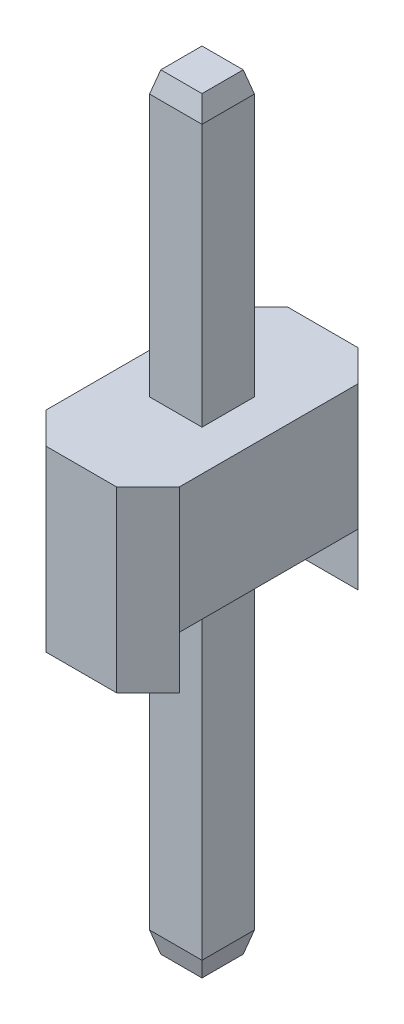
ISO-10303-21;
HEADER;
FILE_DESCRIPTION(('STEP AP214'),'2;1');
FILE_NAME('part.step','',(''),(''),'','','');
FILE_SCHEMA(('AUTOMOTIVE_DESIGN { 1 0 10303 214 1 1 1 1 }'));
ENDSEC;
DATA;
#1=APPLICATION_CONTEXT('core data for automotive mechanical design processes');
#2=APPLICATION_PROTOCOL_DEFINITION('international standard','automotive_design',2000,#1);
#3=PRODUCT_CONTEXT('',#1,'mechanical');
#4=PRODUCT('Part','Part','',(#3));
#5=PRODUCT_RELATED_PRODUCT_CATEGORY('part','',(#4));
#6=PRODUCT_DEFINITION_FORMATION('','',#4);
#7=PRODUCT_DEFINITION_CONTEXT('part definition',#1,'design');
#8=PRODUCT_DEFINITION('design','',#6,#7);
#9=PRODUCT_DEFINITION_SHAPE('','',#8);
#10=(LENGTH_UNIT() NAMED_UNIT(*) SI_UNIT(.MILLI.,.METRE.));
#11=(NAMED_UNIT(*) PLANE_ANGLE_UNIT() SI_UNIT($,.RADIAN.));
#12=(NAMED_UNIT(*) SI_UNIT($,.STERADIAN.) SOLID_ANGLE_UNIT());
#13=UNCERTAINTY_MEASURE_WITH_UNIT(LENGTH_MEASURE(1.E-05),#10,'distance_accuracy_value','');
#14=(GEOMETRIC_REPRESENTATION_CONTEXT(3) GLOBAL_UNCERTAINTY_ASSIGNED_CONTEXT((#13)) GLOBAL_UNIT_ASSIGNED_CONTEXT((#10,
#11,#12)) REPRESENTATION_CONTEXT('',''));
#15=CARTESIAN_POINT('',(0.,0.,0.));
#16=DIRECTION('',(0.,0.,1.));
#17=DIRECTION('',(1.,0.,0.));
#18=AXIS2_PLACEMENT_3D('',#15,#16,#17);
#19=CARTESIAN_POINT('',(0.,0.5,0.));
#20=DIRECTION('',(0.,-1.,0.));
#21=DIRECTION('',(0.,0.,-1.));
#22=AXIS2_PLACEMENT_3D('',#19,#20,#21);
#23=PLANE('',#22);
#24=DIRECTION('',(0.,0.,-1.));
#25=VECTOR('',#24,1.);
#26=CARTESIAN_POINT('',(-0.635,0.5,0.849999999999998));
#27=LINE('',#26,#25);
#28=CARTESIAN_POINT('',(-0.635,0.5,0.849999999999998));
#29=VERTEX_POINT('',#28);
#30=CARTESIAN_POINT('',(-0.635,0.5,-0.849999999999999));
#31=VERTEX_POINT('',#30);
#32=EDGE_CURVE('E241',#29,#31,#27,.T.);
#33=ORIENTED_EDGE('',*,*,#32,.T.);
#34=DIRECTION('',(1.,0.,0.));
#35=VECTOR('',#34,1.);
#36=CARTESIAN_POINT('',(-0.635,0.5,-0.849999999999999));
#37=LINE('',#36,#35);
#38=CARTESIAN_POINT('',(0.635,0.5,-0.849999999999999));
#39=VERTEX_POINT('',#38);
#40=EDGE_CURVE('E244',#31,#39,#37,.T.);
#41=ORIENTED_EDGE('',*,*,#40,.T.);
#42=DIRECTION('',(0.,0.,1.));
#43=VECTOR('',#42,1.);
#44=CARTESIAN_POINT('',(0.635,0.5,0.849999999999998));
#45=LINE('',#44,#43);
#46=CARTESIAN_POINT('',(0.635,0.5,0.849999999999998));
#47=VERTEX_POINT('',#46);
#48=EDGE_CURVE('E248',#39,#47,#45,.T.);
#49=ORIENTED_EDGE('',*,*,#48,.T.);
#50=DIRECTION('',(-1.,0.,0.));
#51=VECTOR('',#50,1.);
#52=CARTESIAN_POINT('',(-0.635,0.5,0.849999999999998));
#53=LINE('',#52,#51);
#54=EDGE_CURVE('E250',#47,#29,#53,.T.);
#55=ORIENTED_EDGE('',*,*,#54,.T.);
#56=EDGE_LOOP('',(#33,#41,#49,#55));
#57=FACE_BOUND('',#56,.T.);
#58=DIRECTION('',(0.,0.,-1.));
#59=VECTOR('',#58,1.);
#60=CARTESIAN_POINT('',(-0.25,0.5,0.25));
#61=LINE('',#60,#59);
#62=CARTESIAN_POINT('',(-0.25,0.5,0.25));
#63=VERTEX_POINT('',#62);
#64=CARTESIAN_POINT('',(-0.25,0.5,-0.25));
#65=VERTEX_POINT('',#64);
#66=EDGE_CURVE('E201',#63,#65,#61,.T.);
#67=ORIENTED_EDGE('',*,*,#66,.F.);
#68=DIRECTION('',(-1.,0.,0.));
#69=VECTOR('',#68,1.);
#70=CARTESIAN_POINT('',(0.25,0.5,0.25));
#71=LINE('',#70,#69);
#72=CARTESIAN_POINT('',(0.25,0.5,0.25));
#73=VERTEX_POINT('',#72);
#74=EDGE_CURVE('E213',#73,#63,#71,.T.);
#75=ORIENTED_EDGE('',*,*,#74,.F.);
#76=DIRECTION('',(0.,0.,1.));
#77=VECTOR('',#76,1.);
#78=CARTESIAN_POINT('',(0.25,0.5,0.25));
#79=LINE('',#78,#77);
#80=CARTESIAN_POINT('',(0.25,0.5,-0.25));
#81=VERTEX_POINT('',#80);
#82=EDGE_CURVE('E211',#81,#73,#79,.T.);
#83=ORIENTED_EDGE('',*,*,#82,.F.);
#84=DIRECTION('',(1.,0.,0.));
#85=VECTOR('',#84,1.);
#86=CARTESIAN_POINT('',(0.25,0.5,-0.25));
#87=LINE('',#86,#85);
#88=EDGE_CURVE('E190',#65,#81,#87,.T.);
#89=ORIENTED_EDGE('',*,*,#88,.F.);
#90=EDGE_LOOP('',(#67,#75,#83,#89));
#91=FACE_BOUND('',#90,.T.);
#92=ADVANCED_FACE('F35',(#57,#91),#23,.T.);
#93=CARTESIAN_POINT('',(0.,1.7,0.));
#94=DIRECTION('',(0.,-1.,0.));
#95=DIRECTION('',(0.,0.,-1.));
#96=AXIS2_PLACEMENT_3D('',#93,#94,#95);
#97=PLANE('',#96);
#98=DIRECTION('',(-1.,0.,0.));
#99=VECTOR('',#98,1.);
#100=CARTESIAN_POINT('',(0.635,1.7,-1.15));
#101=LINE('',#100,#99);
#102=CARTESIAN_POINT('',(0.335,1.7,-1.15));
#103=VERTEX_POINT('',#102);
#104=CARTESIAN_POINT('',(-0.334999999999999,1.7,-1.15));
#105=VERTEX_POINT('',#104);
#106=EDGE_CURVE('E270',#103,#105,#101,.T.);
#107=ORIENTED_EDGE('',*,*,#106,.T.);
#108=DIRECTION('',(0.707106781186548,0.,-0.707106781186547));
#109=VECTOR('',#108,1.);
#110=CARTESIAN_POINT('',(-0.635,1.7,-0.85));
#111=LINE('',#110,#109);
#112=CARTESIAN_POINT('',(-0.635,1.7,-0.85));
#113=VERTEX_POINT('',#112);
#114=EDGE_CURVE('E304',#105,#113,#111,.F.);
#115=ORIENTED_EDGE('',*,*,#114,.T.);
#116=DIRECTION('',(0.,0.,1.));
#117=VECTOR('',#116,1.);
#118=CARTESIAN_POINT('',(-0.635,1.7,-1.15));
#119=LINE('',#118,#117);
#120=CARTESIAN_POINT('',(-0.635,1.7,0.849999999999998));
#121=VERTEX_POINT('',#120);
#122=EDGE_CURVE('E260',#113,#121,#119,.T.);
#123=ORIENTED_EDGE('',*,*,#122,.T.);
#124=DIRECTION('',(-0.707106781186546,0.,-0.707106781186549));
#125=VECTOR('',#124,1.);
#126=CARTESIAN_POINT('',(-0.335,1.7,1.15));
#127=LINE('',#126,#125);
#128=CARTESIAN_POINT('',(-0.335,1.7,1.15));
#129=VERTEX_POINT('',#128);
#130=EDGE_CURVE('E298',#121,#129,#127,.F.);
#131=ORIENTED_EDGE('',*,*,#130,.T.);
#132=DIRECTION('',(1.,0.,0.));
#133=VECTOR('',#132,1.);
#134=CARTESIAN_POINT('',(0.635,1.7,1.15));
#135=LINE('',#134,#133);
#136=CARTESIAN_POINT('',(0.334999999999999,1.7,1.15));
#137=VERTEX_POINT('',#136);
#138=EDGE_CURVE('E263',#129,#137,#135,.T.);
#139=ORIENTED_EDGE('',*,*,#138,.T.);
#140=DIRECTION('',(-0.707106781186548,0.,0.707106781186547));
#141=VECTOR('',#140,1.);
#142=CARTESIAN_POINT('',(0.635,1.7,0.85));
#143=LINE('',#142,#141);
#144=CARTESIAN_POINT('',(0.635,1.7,0.85));
#145=VERTEX_POINT('',#144);
#146=EDGE_CURVE('E300',#137,#145,#143,.F.);
#147=ORIENTED_EDGE('',*,*,#146,.T.);
#148=DIRECTION('',(0.,0.,-1.));
#149=VECTOR('',#148,1.);
#150=CARTESIAN_POINT('',(0.635,1.7,-1.15));
#151=LINE('',#150,#149);
#152=CARTESIAN_POINT('',(0.635,1.7,-0.849999999999999));
#153=VERTEX_POINT('',#152);
#154=EDGE_CURVE('E267',#145,#153,#151,.T.);
#155=ORIENTED_EDGE('',*,*,#154,.T.);
#156=DIRECTION('',(0.707106781186546,0.,0.707106781186549));
#157=VECTOR('',#156,1.);
#158=CARTESIAN_POINT('',(0.335,1.7,-1.15));
#159=LINE('',#158,#157);
#160=EDGE_CURVE('E302',#153,#103,#159,.F.);
#161=ORIENTED_EDGE('',*,*,#160,.T.);
#162=EDGE_LOOP('',(#107,#115,#123,#131,#139,#147,#155,#161));
#163=FACE_BOUND('',#162,.T.);
#164=DIRECTION('',(0.,0.,-1.));
#165=VECTOR('',#164,1.);
#166=CARTESIAN_POINT('',(0.25,1.7,-0.25));
#167=LINE('',#166,#165);
#168=CARTESIAN_POINT('',(0.25,1.7,0.25));
#169=VERTEX_POINT('',#168);
#170=CARTESIAN_POINT('',(0.25,1.7,-0.25));
#171=VERTEX_POINT('',#170);
#172=EDGE_CURVE('E197',#169,#171,#167,.T.);
#173=ORIENTED_EDGE('',*,*,#172,.F.);
#174=DIRECTION('',(1.,0.,0.));
#175=VECTOR('',#174,1.);
#176=CARTESIAN_POINT('',(-0.25,1.7,0.25));
#177=LINE('',#176,#175);
#178=CARTESIAN_POINT('',(-0.25,1.7,0.25));
#179=VERTEX_POINT('',#178);
#180=EDGE_CURVE('E229',#179,#169,#177,.T.);
#181=ORIENTED_EDGE('',*,*,#180,.F.);
#182=DIRECTION('',(0.,0.,1.));
#183=VECTOR('',#182,1.);
#184=CARTESIAN_POINT('',(-0.25,1.7,-0.25));
#185=LINE('',#184,#183);
#186=CARTESIAN_POINT('',(-0.25,1.7,-0.25));
#187=VERTEX_POINT('',#186);
#188=EDGE_CURVE('E226',#187,#179,#185,.T.);
#189=ORIENTED_EDGE('',*,*,#188,.F.);
#190=DIRECTION('',(-1.,0.,0.));
#191=VECTOR('',#190,1.);
#192=CARTESIAN_POINT('',(-0.25,1.7,-0.25));
#193=LINE('',#192,#191);
#194=EDGE_CURVE('E223',#171,#187,#193,.T.);
#195=ORIENTED_EDGE('',*,*,#194,.F.);
#196=EDGE_LOOP('',(#173,#181,#189,#195));
#197=FACE_BOUND('',#196,.T.);
#198=ADVANCED_FACE('F402',(#163,#197),#97,.F.);
#199=CARTESIAN_POINT('',(-0.635,1.7,-1.15));
#200=DIRECTION('',(1.,0.,0.));
#201=DIRECTION('',(0.,0.,-1.));
#202=AXIS2_PLACEMENT_3D('',#199,#200,#201);
#203=PLANE('',#202);
#204=ORIENTED_EDGE('',*,*,#32,.F.);
#205=DIRECTION('',(0.,1.,0.));
#206=VECTOR('',#205,1.);
#207=CARTESIAN_POINT('',(-0.635,1.7,0.849999999999998));
#208=LINE('',#207,#206);
#209=EDGE_CURVE('E273',#29,#121,#208,.T.);
#210=ORIENTED_EDGE('',*,*,#209,.T.);
#211=ORIENTED_EDGE('',*,*,#122,.F.);
#212=DIRECTION('',(0.,-1.,0.));
#213=VECTOR('',#212,1.);
#214=CARTESIAN_POINT('',(-0.635,1.7,-0.85));
#215=LINE('',#214,#213);
#216=EDGE_CURVE('E280',#113,#31,#215,.T.);
#217=ORIENTED_EDGE('',*,*,#216,.T.);
#218=EDGE_LOOP('',(#204,#210,#211,#217));
#219=FACE_BOUND('',#218,.T.);
#220=ADVANCED_FACE('F408',(#219),#203,.F.);
#221=CARTESIAN_POINT('',(0.635,1.7,-1.15));
#222=DIRECTION('',(-1.,0.,0.));
#223=DIRECTION('',(0.,0.,1.));
#224=AXIS2_PLACEMENT_3D('',#221,#222,#223);
#225=PLANE('',#224);
#226=ORIENTED_EDGE('',*,*,#48,.F.);
#227=DIRECTION('',(0.,1.,0.));
#228=VECTOR('',#227,1.);
#229=CARTESIAN_POINT('',(0.635,1.7,-0.849999999999999));
#230=LINE('',#229,#228);
#231=EDGE_CURVE('E309',#39,#153,#230,.T.);
#232=ORIENTED_EDGE('',*,*,#231,.T.);
#233=ORIENTED_EDGE('',*,*,#154,.F.);
#234=DIRECTION('',(0.,-1.,0.));
#235=VECTOR('',#234,1.);
#236=CARTESIAN_POINT('',(0.635,1.7,0.85));
#237=LINE('',#236,#235);
#238=EDGE_CURVE('E306',#145,#47,#237,.T.);
#239=ORIENTED_EDGE('',*,*,#238,.T.);
#240=EDGE_LOOP('',(#226,#232,#233,#239));
#241=FACE_BOUND('',#240,.T.);
#242=ADVANCED_FACE('F434',(#241),#225,.F.);
#243=CARTESIAN_POINT('',(0.,0.,0.));
#244=DIRECTION('',(0.,-1.,0.));
#245=DIRECTION('',(0.,0.,-1.));
#246=AXIS2_PLACEMENT_3D('',#243,#244,#245);
#247=PLANE('',#246);
#248=DIRECTION('',(-1.,0.,0.));
#249=VECTOR('',#248,1.);
#250=CARTESIAN_POINT('',(-0.635,0.,0.849999999999998));
#251=LINE('',#250,#249);
#252=CARTESIAN_POINT('',(0.635,0.,0.849999999999998));
#253=VERTEX_POINT('',#252);
#254=CARTESIAN_POINT('',(-0.635,0.,0.849999999999998));
#255=VERTEX_POINT('',#254);
#256=EDGE_CURVE('E245',#253,#255,#251,.T.);
#257=ORIENTED_EDGE('',*,*,#256,.F.);
#258=DIRECTION('',(0.707106781186548,0.,-0.707106781186547));
#259=VECTOR('',#258,1.);
#260=CARTESIAN_POINT('',(0.742499999999999,0.,0.742500000000001));
#261=LINE('',#260,#259);
#262=CARTESIAN_POINT('',(0.334999999999999,0.,1.15));
#263=VERTEX_POINT('',#262);
#264=EDGE_CURVE('E286',#253,#263,#261,.F.);
#265=ORIENTED_EDGE('',*,*,#264,.T.);
#266=DIRECTION('',(1.,0.,0.));
#267=VECTOR('',#266,1.);
#268=CARTESIAN_POINT('',(0.635,0.,1.15));
#269=LINE('',#268,#267);
#270=CARTESIAN_POINT('',(-0.335,0.,1.15));
#271=VERTEX_POINT('',#270);
#272=EDGE_CURVE('E258',#271,#263,#269,.T.);
#273=ORIENTED_EDGE('',*,*,#272,.F.);
#274=DIRECTION('',(0.707106781186546,0.,0.707106781186549));
#275=VECTOR('',#274,1.);
#276=CARTESIAN_POINT('',(-0.7425,0.,0.742499999999997));
#277=LINE('',#276,#275);
#278=EDGE_CURVE('E283',#271,#255,#277,.F.);
#279=ORIENTED_EDGE('',*,*,#278,.T.);
#280=EDGE_LOOP('',(#257,#265,#273,#279));
#281=FACE_BOUND('',#280,.T.);
#282=ADVANCED_FACE('F429',(#281),#247,.T.);
#283=CARTESIAN_POINT('',(0.635,1.7,1.15));
#284=DIRECTION('',(0.,0.,-1.));
#285=DIRECTION('',(-1.,0.,0.));
#286=AXIS2_PLACEMENT_3D('',#283,#284,#285);
#287=PLANE('',#286);
#288=ORIENTED_EDGE('',*,*,#272,.T.);
#289=DIRECTION('',(0.,1.,0.));
#290=VECTOR('',#289,1.);
#291=CARTESIAN_POINT('',(0.334999999999999,1.7,1.15));
#292=LINE('',#291,#290);
#293=EDGE_CURVE('E315',#263,#137,#292,.T.);
#294=ORIENTED_EDGE('',*,*,#293,.T.);
#295=ORIENTED_EDGE('',*,*,#138,.F.);
#296=DIRECTION('',(0.,-1.,0.));
#297=VECTOR('',#296,1.);
#298=CARTESIAN_POINT('',(-0.335,1.7,1.15));
#299=LINE('',#298,#297);
#300=EDGE_CURVE('E312',#129,#271,#299,.T.);
#301=ORIENTED_EDGE('',*,*,#300,.T.);
#302=EDGE_LOOP('',(#288,#294,#295,#301));
#303=FACE_BOUND('',#302,.T.);
#304=ADVANCED_FACE('F432',(#303),#287,.F.);
#305=CARTESIAN_POINT('',(0.635,1.7,-1.15));
#306=DIRECTION('',(0.,0.,1.));
#307=DIRECTION('',(1.,0.,0.));
#308=AXIS2_PLACEMENT_3D('',#305,#306,#307);
#309=PLANE('',#308);
#310=DIRECTION('',(-1.,0.,0.));
#311=VECTOR('',#310,1.);
#312=CARTESIAN_POINT('',(0.635,0.,-1.15));
#313=LINE('',#312,#311);
#314=CARTESIAN_POINT('',(0.335,0.,-1.15));
#315=VERTEX_POINT('',#314);
#316=CARTESIAN_POINT('',(-0.335,0.,-1.15));
#317=VERTEX_POINT('',#316);
#318=EDGE_CURVE('E264',#315,#317,#313,.T.);
#319=ORIENTED_EDGE('',*,*,#318,.T.);
#320=DIRECTION('',(0.,1.,0.));
#321=VECTOR('',#320,1.);
#322=CARTESIAN_POINT('',(-0.335,1.7,-1.15));
#323=LINE('',#322,#321);
#324=EDGE_CURVE('E296',#317,#105,#323,.T.);
#325=ORIENTED_EDGE('',*,*,#324,.T.);
#326=ORIENTED_EDGE('',*,*,#106,.F.);
#327=DIRECTION('',(0.,-1.,0.));
#328=VECTOR('',#327,1.);
#329=CARTESIAN_POINT('',(0.335,1.7,-1.15));
#330=LINE('',#329,#328);
#331=EDGE_CURVE('E293',#103,#315,#330,.T.);
#332=ORIENTED_EDGE('',*,*,#331,.T.);
#333=EDGE_LOOP('',(#319,#325,#326,#332));
#334=FACE_BOUND('',#333,.T.);
#335=ADVANCED_FACE('F427',(#334),#309,.F.);
#336=DIRECTION('',(1.,0.,0.));
#337=VECTOR('',#336,1.);
#338=CARTESIAN_POINT('',(-0.635,0.,-0.849999999999999));
#339=LINE('',#338,#337);
#340=CARTESIAN_POINT('',(-0.635,0.,-0.849999999999999));
#341=VERTEX_POINT('',#340);
#342=CARTESIAN_POINT('',(0.635,0.,-0.849999999999999));
#343=VERTEX_POINT('',#342);
#344=EDGE_CURVE('E240',#341,#343,#339,.T.);
#345=ORIENTED_EDGE('',*,*,#344,.F.);
#346=DIRECTION('',(-0.707106781186548,0.,0.707106781186547));
#347=VECTOR('',#346,1.);
#348=CARTESIAN_POINT('',(-0.742499999999999,0.,-0.742500000000001));
#349=LINE('',#348,#347);
#350=EDGE_CURVE('E291',#341,#317,#349,.F.);
#351=ORIENTED_EDGE('',*,*,#350,.T.);
#352=ORIENTED_EDGE('',*,*,#318,.F.);
#353=DIRECTION('',(-0.707106781186546,0.,-0.707106781186549));
#354=VECTOR('',#353,1.);
#355=CARTESIAN_POINT('',(0.7425,0.,-0.742499999999998));
#356=LINE('',#355,#354);
#357=EDGE_CURVE('E288',#315,#343,#356,.F.);
#358=ORIENTED_EDGE('',*,*,#357,.T.);
#359=EDGE_LOOP('',(#345,#351,#352,#358));
#360=FACE_BOUND('',#359,.T.);
#361=ADVANCED_FACE('F423',(#360),#247,.T.);
#362=CARTESIAN_POINT('',(-0.635,1.7,-0.85));
#363=DIRECTION('',(0.707106781186547,0.,0.707106781186548));
#364=DIRECTION('',(0.,-1.,0.));
#365=AXIS2_PLACEMENT_3D('',#362,#363,#364);
#366=PLANE('',#365);
#367=ORIENTED_EDGE('',*,*,#114,.F.);
#368=ORIENTED_EDGE('',*,*,#324,.F.);
#369=ORIENTED_EDGE('',*,*,#350,.F.);
#370=DIRECTION('',(0.,-1.,0.));
#371=VECTOR('',#370,1.);
#372=CARTESIAN_POINT('',(-0.635,0.5,-0.849999999999999));
#373=LINE('',#372,#371);
#374=EDGE_CURVE('E253',#31,#341,#373,.T.);
#375=ORIENTED_EDGE('',*,*,#374,.F.);
#376=ORIENTED_EDGE('',*,*,#216,.F.);
#377=EDGE_LOOP('',(#367,#368,#369,#375,#376));
#378=FACE_BOUND('',#377,.T.);
#379=ADVANCED_FACE('F426',(#378),#366,.F.);
#380=CARTESIAN_POINT('',(0.335,1.7,-1.15));
#381=DIRECTION('',(-0.707106781186549,0.,0.707106781186546));
#382=DIRECTION('',(0.,-1.,0.));
#383=AXIS2_PLACEMENT_3D('',#380,#381,#382);
#384=PLANE('',#383);
#385=ORIENTED_EDGE('',*,*,#160,.F.);
#386=ORIENTED_EDGE('',*,*,#231,.F.);
#387=EDGE_CURVE('E310',#343,#39,#230,.T.);
#388=ORIENTED_EDGE('',*,*,#387,.F.);
#389=ORIENTED_EDGE('',*,*,#357,.F.);
#390=ORIENTED_EDGE('',*,*,#331,.F.);
#391=EDGE_LOOP('',(#385,#386,#388,#389,#390));
#392=FACE_BOUND('',#391,.T.);
#393=ADVANCED_FACE('F446',(#392),#384,.F.);
#394=CARTESIAN_POINT('',(0.635,1.7,0.85));
#395=DIRECTION('',(-0.707106781186547,0.,-0.707106781186548));
#396=DIRECTION('',(0.,-1.,0.));
#397=AXIS2_PLACEMENT_3D('',#394,#395,#396);
#398=PLANE('',#397);
#399=ORIENTED_EDGE('',*,*,#146,.F.);
#400=ORIENTED_EDGE('',*,*,#293,.F.);
#401=ORIENTED_EDGE('',*,*,#264,.F.);
#402=DIRECTION('',(0.,-1.,0.));
#403=VECTOR('',#402,1.);
#404=CARTESIAN_POINT('',(0.635,0.5,0.849999999999998));
#405=LINE('',#404,#403);
#406=EDGE_CURVE('E256',#47,#253,#405,.T.);
#407=ORIENTED_EDGE('',*,*,#406,.F.);
#408=ORIENTED_EDGE('',*,*,#238,.F.);
#409=EDGE_LOOP('',(#399,#400,#401,#407,#408));
#410=FACE_BOUND('',#409,.T.);
#411=ADVANCED_FACE('F450',(#410),#398,.F.);
#412=CARTESIAN_POINT('',(-0.335,1.7,1.15));
#413=DIRECTION('',(0.707106781186549,0.,-0.707106781186546));
#414=DIRECTION('',(0.,-1.,0.));
#415=AXIS2_PLACEMENT_3D('',#412,#413,#414);
#416=PLANE('',#415);
#417=ORIENTED_EDGE('',*,*,#130,.F.);
#418=ORIENTED_EDGE('',*,*,#209,.F.);
#419=EDGE_CURVE('E278',#255,#29,#208,.T.);
#420=ORIENTED_EDGE('',*,*,#419,.F.);
#421=ORIENTED_EDGE('',*,*,#278,.F.);
#422=ORIENTED_EDGE('',*,*,#300,.F.);
#423=EDGE_LOOP('',(#417,#418,#420,#421,#422));
#424=FACE_BOUND('',#423,.T.);
#425=ADVANCED_FACE('F418',(#424),#416,.F.);
#426=CARTESIAN_POINT('',(-0.635,0.5,0.849999999999998));
#427=DIRECTION('',(0.,0.,1.));
#428=DIRECTION('',(1.,0.,0.));
#429=AXIS2_PLACEMENT_3D('',#426,#427,#428);
#430=PLANE('',#429);
#431=ORIENTED_EDGE('',*,*,#256,.T.);
#432=ORIENTED_EDGE('',*,*,#419,.T.);
#433=ORIENTED_EDGE('',*,*,#54,.F.);
#434=ORIENTED_EDGE('',*,*,#406,.T.);
#435=EDGE_LOOP('',(#431,#432,#433,#434));
#436=FACE_BOUND('',#435,.T.);
#437=ADVANCED_FACE('F414',(#436),#430,.F.);
#438=CARTESIAN_POINT('',(-0.635,0.5,-0.849999999999999));
#439=DIRECTION('',(0.,0.,-1.));
#440=DIRECTION('',(-1.,0.,0.));
#441=AXIS2_PLACEMENT_3D('',#438,#439,#440);
#442=PLANE('',#441);
#443=ORIENTED_EDGE('',*,*,#344,.T.);
#444=ORIENTED_EDGE('',*,*,#387,.T.);
#445=ORIENTED_EDGE('',*,*,#40,.F.);
#446=ORIENTED_EDGE('',*,*,#374,.T.);
#447=EDGE_LOOP('',(#443,#444,#445,#446));
#448=FACE_BOUND('',#447,.T.);
#449=ADVANCED_FACE('F417',(#448),#442,.F.);
#450=CARTESIAN_POINT('',(0.25,4.4,-0.25));
#451=DIRECTION('',(-1.,0.,0.));
#452=DIRECTION('',(0.,0.,1.));
#453=AXIS2_PLACEMENT_3D('',#450,#451,#452);
#454=PLANE('',#453);
#455=DIRECTION('',(0.,-1.,0.));
#456=VECTOR('',#455,1.);
#457=CARTESIAN_POINT('',(0.25,4.4,-0.25));
#458=LINE('',#457,#456);
#459=CARTESIAN_POINT('',(0.25,4.2,-0.25));
#460=VERTEX_POINT('',#459);
#461=EDGE_CURVE('E238',#460,#171,#458,.T.);
#462=ORIENTED_EDGE('',*,*,#461,.F.);
#463=DIRECTION('',(0.,0.,1.));
#464=VECTOR('',#463,1.);
#465=CARTESIAN_POINT('',(0.25,4.2,0.25));
#466=LINE('',#465,#464);
#467=CARTESIAN_POINT('',(0.25,4.2,0.25));
#468=VERTEX_POINT('',#467);
#469=EDGE_CURVE('E12',#460,#468,#466,.T.);
#470=ORIENTED_EDGE('',*,*,#469,.T.);
#471=DIRECTION('',(0.,-1.,0.));
#472=VECTOR('',#471,1.);
#473=CARTESIAN_POINT('',(0.25,4.4,0.25));
#474=LINE('',#473,#472);
#475=EDGE_CURVE('E232',#468,#169,#474,.T.);
#476=ORIENTED_EDGE('',*,*,#475,.T.);
#477=ORIENTED_EDGE('',*,*,#172,.T.);
#478=EDGE_LOOP('',(#462,#470,#476,#477));
#479=FACE_BOUND('',#478,.T.);
#480=ADVANCED_FACE('F377',(#479),#454,.F.);
#481=CARTESIAN_POINT('',(-0.25,4.4,-0.25));
#482=DIRECTION('',(0.,0.,1.));
#483=DIRECTION('',(1.,0.,0.));
#484=AXIS2_PLACEMENT_3D('',#481,#482,#483);
#485=PLANE('',#484);
#486=DIRECTION('',(0.,-1.,0.));
#487=VECTOR('',#486,1.);
#488=CARTESIAN_POINT('',(-0.25,4.4,-0.25));
#489=LINE('',#488,#487);
#490=CARTESIAN_POINT('',(-0.25,4.2,-0.25));
#491=VERTEX_POINT('',#490);
#492=EDGE_CURVE('E236',#491,#187,#489,.T.);
#493=ORIENTED_EDGE('',*,*,#492,.F.);
#494=DIRECTION('',(1.,0.,0.));
#495=VECTOR('',#494,1.);
#496=CARTESIAN_POINT('',(0.25,4.2,-0.25));
#497=LINE('',#496,#495);
#498=EDGE_CURVE('E44',#491,#460,#497,.T.);
#499=ORIENTED_EDGE('',*,*,#498,.T.);
#500=ORIENTED_EDGE('',*,*,#461,.T.);
#501=ORIENTED_EDGE('',*,*,#194,.T.);
#502=EDGE_LOOP('',(#493,#499,#500,#501));
#503=FACE_BOUND('',#502,.T.);
#504=ADVANCED_FACE('F549',(#503),#485,.F.);
#505=CARTESIAN_POINT('',(-0.25,4.4,-0.25));
#506=DIRECTION('',(1.,0.,0.));
#507=DIRECTION('',(0.,0.,-1.));
#508=AXIS2_PLACEMENT_3D('',#505,#506,#507);
#509=PLANE('',#508);
#510=DIRECTION('',(0.,-1.,0.));
#511=VECTOR('',#510,1.);
#512=CARTESIAN_POINT('',(-0.25,4.4,0.25));
#513=LINE('',#512,#511);
#514=CARTESIAN_POINT('',(-0.25,4.2,0.25));
#515=VERTEX_POINT('',#514);
#516=EDGE_CURVE('E234',#515,#179,#513,.T.);
#517=ORIENTED_EDGE('',*,*,#516,.F.);
#518=DIRECTION('',(0.,0.,-1.));
#519=VECTOR('',#518,1.);
#520=CARTESIAN_POINT('',(-0.25,4.2,-0.25));
#521=LINE('',#520,#519);
#522=EDGE_CURVE('E59',#515,#491,#521,.T.);
#523=ORIENTED_EDGE('',*,*,#522,.T.);
#524=ORIENTED_EDGE('',*,*,#492,.T.);
#525=ORIENTED_EDGE('',*,*,#188,.T.);
#526=EDGE_LOOP('',(#517,#523,#524,#525));
#527=FACE_BOUND('',#526,.T.);
#528=ADVANCED_FACE('F398',(#527),#509,.F.);
#529=CARTESIAN_POINT('',(-0.25,4.4,0.25));
#530=DIRECTION('',(0.,0.,-1.));
#531=DIRECTION('',(-1.,0.,0.));
#532=AXIS2_PLACEMENT_3D('',#529,#530,#531);
#533=PLANE('',#532);
#534=ORIENTED_EDGE('',*,*,#475,.F.);
#535=DIRECTION('',(-1.,0.,0.));
#536=VECTOR('',#535,1.);
#537=CARTESIAN_POINT('',(-0.25,4.2,0.25));
#538=LINE('',#537,#536);
#539=EDGE_CURVE('E342',#468,#515,#538,.T.);
#540=ORIENTED_EDGE('',*,*,#539,.T.);
#541=ORIENTED_EDGE('',*,*,#516,.T.);
#542=ORIENTED_EDGE('',*,*,#180,.T.);
#543=EDGE_LOOP('',(#534,#540,#541,#542));
#544=FACE_BOUND('',#543,.T.);
#545=ADVANCED_FACE('F381',(#544),#533,.F.);
#546=CARTESIAN_POINT('',(0.,4.4,0.));
#547=DIRECTION('',(0.,1.,0.));
#548=DIRECTION('',(0.,0.,1.));
#549=AXIS2_PLACEMENT_3D('',#546,#547,#548);
#550=PLANE('',#549);
#551=DIRECTION('',(0.,0.,1.));
#552=VECTOR('',#551,1.);
#553=CARTESIAN_POINT('',(-0.196410161513776,4.4,0.25));
#554=LINE('',#553,#552);
#555=CARTESIAN_POINT('',(-0.196410161513776,4.4,-0.196410161513776));
#556=VERTEX_POINT('',#555);
#557=CARTESIAN_POINT('',(-0.196410161513776,4.4,0.196410161513776));
#558=VERTEX_POINT('',#557);
#559=EDGE_CURVE('E337',#556,#558,#554,.T.);
#560=ORIENTED_EDGE('',*,*,#559,.T.);
#561=DIRECTION('',(1.,0.,0.));
#562=VECTOR('',#561,1.);
#563=CARTESIAN_POINT('',(0.25,4.4,0.196410161513776));
#564=LINE('',#563,#562);
#565=CARTESIAN_POINT('',(0.196410161513776,4.4,0.196410161513776));
#566=VERTEX_POINT('',#565);
#567=EDGE_CURVE('E339',#558,#566,#564,.T.);
#568=ORIENTED_EDGE('',*,*,#567,.T.);
#569=DIRECTION('',(0.,0.,-1.));
#570=VECTOR('',#569,1.);
#571=CARTESIAN_POINT('',(0.196410161513776,4.4,-0.25));
#572=LINE('',#571,#570);
#573=CARTESIAN_POINT('',(0.196410161513776,4.4,-0.196410161513776));
#574=VERTEX_POINT('',#573);
#575=EDGE_CURVE('E333',#566,#574,#572,.T.);
#576=ORIENTED_EDGE('',*,*,#575,.T.);
#577=DIRECTION('',(-1.,0.,0.));
#578=VECTOR('',#577,1.);
#579=CARTESIAN_POINT('',(-0.25,4.4,-0.196410161513776));
#580=LINE('',#579,#578);
#581=EDGE_CURVE('E335',#574,#556,#580,.T.);
#582=ORIENTED_EDGE('',*,*,#581,.T.);
#583=EDGE_LOOP('',(#560,#568,#576,#582));
#584=FACE_BOUND('',#583,.T.);
#585=ADVANCED_FACE('F387',(#584),#550,.T.);
#586=CARTESIAN_POINT('',(0.25,-10.9071067811865,0.25));
#587=DIRECTION('',(0.,0.,-1.));
#588=DIRECTION('',(-1.,0.,0.));
#589=AXIS2_PLACEMENT_3D('',#586,#587,#588);
#590=PLANE('',#589);
#591=DIRECTION('',(0.,1.,0.));
#592=VECTOR('',#591,1.);
#593=CARTESIAN_POINT('',(-0.25,-10.9071067811865,0.25));
#594=LINE('',#593,#592);
#595=CARTESIAN_POINT('',(-0.25,-2.7,0.25));
#596=VERTEX_POINT('',#595);
#597=EDGE_CURVE('E204',#596,#63,#594,.T.);
#598=ORIENTED_EDGE('',*,*,#597,.F.);
#599=DIRECTION('',(1.,0.,0.));
#600=VECTOR('',#599,1.);
#601=CARTESIAN_POINT('',(0.25,-2.7,0.25));
#602=LINE('',#601,#600);
#603=CARTESIAN_POINT('',(0.25,-2.7,0.25));
#604=VERTEX_POINT('',#603);
#605=EDGE_CURVE('E328',#596,#604,#602,.T.);
#606=ORIENTED_EDGE('',*,*,#605,.T.);
#607=DIRECTION('',(0.,1.,0.));
#608=VECTOR('',#607,1.);
#609=CARTESIAN_POINT('',(0.25,-10.9071067811865,0.25));
#610=LINE('',#609,#608);
#611=EDGE_CURVE('E218',#604,#73,#610,.T.);
#612=ORIENTED_EDGE('',*,*,#611,.T.);
#613=ORIENTED_EDGE('',*,*,#74,.T.);
#614=EDGE_LOOP('',(#598,#606,#612,#613));
#615=FACE_BOUND('',#614,.T.);
#616=ADVANCED_FACE('F389',(#615),#590,.F.);
#617=CARTESIAN_POINT('',(0.25,-10.9071067811865,0.25));
#618=DIRECTION('',(-1.,0.,0.));
#619=DIRECTION('',(0.,0.,1.));
#620=AXIS2_PLACEMENT_3D('',#617,#618,#619);
#621=PLANE('',#620);
#622=ORIENTED_EDGE('',*,*,#611,.F.);
#623=DIRECTION('',(0.,0.,-1.));
#624=VECTOR('',#623,1.);
#625=CARTESIAN_POINT('',(0.25,-2.7,0.25));
#626=LINE('',#625,#624);
#627=CARTESIAN_POINT('',(0.25,-2.7,-0.25));
#628=VERTEX_POINT('',#627);
#629=EDGE_CURVE('E330',#604,#628,#626,.T.);
#630=ORIENTED_EDGE('',*,*,#629,.T.);
#631=DIRECTION('',(0.,1.,0.));
#632=VECTOR('',#631,1.);
#633=CARTESIAN_POINT('',(0.25,-10.9071067811865,-0.25));
#634=LINE('',#633,#632);
#635=EDGE_CURVE('E198',#628,#81,#634,.T.);
#636=ORIENTED_EDGE('',*,*,#635,.T.);
#637=ORIENTED_EDGE('',*,*,#82,.T.);
#638=EDGE_LOOP('',(#622,#630,#636,#637));
#639=FACE_BOUND('',#638,.T.);
#640=ADVANCED_FACE('F395',(#639),#621,.F.);
#641=CARTESIAN_POINT('',(0.25,-10.9071067811865,-0.25));
#642=DIRECTION('',(0.,0.,1.));
#643=DIRECTION('',(1.,0.,0.));
#644=AXIS2_PLACEMENT_3D('',#641,#642,#643);
#645=PLANE('',#644);
#646=ORIENTED_EDGE('',*,*,#635,.F.);
#647=DIRECTION('',(-1.,0.,0.));
#648=VECTOR('',#647,1.);
#649=CARTESIAN_POINT('',(0.25,-2.7,-0.25));
#650=LINE('',#649,#648);
#651=CARTESIAN_POINT('',(-0.25,-2.7,-0.25));
#652=VERTEX_POINT('',#651);
#653=EDGE_CURVE('E193',#628,#652,#650,.T.);
#654=ORIENTED_EDGE('',*,*,#653,.T.);
#655=DIRECTION('',(0.,1.,0.));
#656=VECTOR('',#655,1.);
#657=CARTESIAN_POINT('',(-0.25,-10.9071067811865,-0.25));
#658=LINE('',#657,#656);
#659=EDGE_CURVE('E185',#652,#65,#658,.T.);
#660=ORIENTED_EDGE('',*,*,#659,.T.);
#661=ORIENTED_EDGE('',*,*,#88,.T.);
#662=EDGE_LOOP('',(#646,#654,#660,#661));
#663=FACE_BOUND('',#662,.T.);
#664=ADVANCED_FACE('F188',(#663),#645,.F.);
#665=CARTESIAN_POINT('',(-0.25,-10.9071067811865,0.25));
#666=DIRECTION('',(1.,0.,0.));
#667=DIRECTION('',(0.,0.,-1.));
#668=AXIS2_PLACEMENT_3D('',#665,#666,#667);
#669=PLANE('',#668);
#670=ORIENTED_EDGE('',*,*,#659,.F.);
#671=DIRECTION('',(0.,0.,1.));
#672=VECTOR('',#671,1.);
#673=CARTESIAN_POINT('',(-0.25,-2.7,0.25));
#674=LINE('',#673,#672);
#675=EDGE_CURVE('E317',#652,#596,#674,.T.);
#676=ORIENTED_EDGE('',*,*,#675,.T.);
#677=ORIENTED_EDGE('',*,*,#597,.T.);
#678=ORIENTED_EDGE('',*,*,#66,.T.);
#679=EDGE_LOOP('',(#670,#676,#677,#678));
#680=FACE_BOUND('',#679,.T.);
#681=ADVANCED_FACE('F202',(#680),#669,.F.);
#682=CARTESIAN_POINT('',(0.,-2.9,0.));
#683=DIRECTION('',(0.,1.,0.));
#684=DIRECTION('',(0.,0.,1.));
#685=AXIS2_PLACEMENT_3D('',#682,#683,#684);
#686=PLANE('',#685);
#687=DIRECTION('',(-1.,0.,0.));
#688=VECTOR('',#687,1.);
#689=CARTESIAN_POINT('',(0.,-2.9,0.196410161513775));
#690=LINE('',#689,#688);
#691=CARTESIAN_POINT('',(0.196410161513775,-2.9,0.196410161513775));
#692=VERTEX_POINT('',#691);
#693=CARTESIAN_POINT('',(-0.196410161513775,-2.9,0.196410161513775));
#694=VERTEX_POINT('',#693);
#695=EDGE_CURVE('E323',#692,#694,#690,.T.);
#696=ORIENTED_EDGE('',*,*,#695,.T.);
#697=DIRECTION('',(0.,0.,-1.));
#698=VECTOR('',#697,1.);
#699=CARTESIAN_POINT('',(-0.196410161513775,-2.9,0.));
#700=LINE('',#699,#698);
#701=CARTESIAN_POINT('',(-0.196410161513775,-2.9,-0.196410161513775));
#702=VERTEX_POINT('',#701);
#703=EDGE_CURVE('E325',#694,#702,#700,.T.);
#704=ORIENTED_EDGE('',*,*,#703,.T.);
#705=DIRECTION('',(1.,0.,0.));
#706=VECTOR('',#705,1.);
#707=CARTESIAN_POINT('',(0.,-2.9,-0.196410161513775));
#708=LINE('',#707,#706);
#709=CARTESIAN_POINT('',(0.196410161513775,-2.9,-0.196410161513775));
#710=VERTEX_POINT('',#709);
#711=EDGE_CURVE('E319',#702,#710,#708,.T.);
#712=ORIENTED_EDGE('',*,*,#711,.T.);
#713=DIRECTION('',(0.,0.,1.));
#714=VECTOR('',#713,1.);
#715=CARTESIAN_POINT('',(0.196410161513775,-2.9,0.));
#716=LINE('',#715,#714);
#717=EDGE_CURVE('E321',#710,#692,#716,.T.);
#718=ORIENTED_EDGE('',*,*,#717,.T.);
#719=EDGE_LOOP('',(#696,#704,#712,#718));
#720=FACE_BOUND('',#719,.T.);
#721=ADVANCED_FACE('F473',(#720),#686,.F.);
#722=CARTESIAN_POINT('',(0.25,-2.7,0.25));
#723=DIRECTION('',(-0.965925826289069,0.258819045102518,0.));
#724=DIRECTION('',(0.,0.,-1.));
#725=AXIS2_PLACEMENT_3D('',#722,#723,#724);
#726=PLANE('',#725);
#727=DIRECTION('',(-0.250562807085729,-0.935113126531031,-0.250562807085729));
#728=VECTOR('',#727,1.);
#729=CARTESIAN_POINT('',(0.25,-2.7,0.25));
#730=LINE('',#729,#728);
#731=EDGE_CURVE('E351',#692,#604,#730,.F.);
#732=ORIENTED_EDGE('',*,*,#731,.F.);
#733=ORIENTED_EDGE('',*,*,#717,.F.);
#734=DIRECTION('',(-0.250562807085729,-0.935113126531031,0.250562807085729));
#735=VECTOR('',#734,1.);
#736=CARTESIAN_POINT('',(0.25,-2.7,-0.25));
#737=LINE('',#736,#735);
#738=EDGE_CURVE('E208',#628,#710,#737,.T.);
#739=ORIENTED_EDGE('',*,*,#738,.F.);
#740=ORIENTED_EDGE('',*,*,#629,.F.);
#741=EDGE_LOOP('',(#732,#733,#739,#740));
#742=FACE_BOUND('',#741,.T.);
#743=ADVANCED_FACE('F469',(#742),#726,.F.);
#744=CARTESIAN_POINT('',(0.25,-2.7,-0.25));
#745=DIRECTION('',(0.,0.258819045102518,0.965925826289069));
#746=DIRECTION('',(-1.,0.,0.));
#747=AXIS2_PLACEMENT_3D('',#744,#745,#746);
#748=PLANE('',#747);
#749=ORIENTED_EDGE('',*,*,#738,.T.);
#750=ORIENTED_EDGE('',*,*,#711,.F.);
#751=DIRECTION('',(-0.250562807085729,0.935113126531031,-0.250562807085729));
#752=VECTOR('',#751,1.);
#753=CARTESIAN_POINT('',(-0.21860913985266,-2.81715228496316,-0.21860913985266));
#754=LINE('',#753,#752);
#755=EDGE_CURVE('E349',#652,#702,#754,.F.);
#756=ORIENTED_EDGE('',*,*,#755,.F.);
#757=ORIENTED_EDGE('',*,*,#653,.F.);
#758=EDGE_LOOP('',(#749,#750,#756,#757));
#759=FACE_BOUND('',#758,.T.);
#760=ADVANCED_FACE('F465',(#759),#748,.F.);
#761=CARTESIAN_POINT('',(0.25,-2.7,0.25));
#762=DIRECTION('',(0.,0.258819045102518,-0.965925826289069));
#763=DIRECTION('',(1.,0.,0.));
#764=AXIS2_PLACEMENT_3D('',#761,#762,#763);
#765=PLANE('',#764);
#766=ORIENTED_EDGE('',*,*,#731,.T.);
#767=ORIENTED_EDGE('',*,*,#605,.F.);
#768=DIRECTION('',(0.250562807085729,-0.935113126531031,-0.250562807085729));
#769=VECTOR('',#768,1.);
#770=CARTESIAN_POINT('',(-0.21860913985266,-2.81715228496316,0.21860913985266));
#771=LINE('',#770,#769);
#772=EDGE_CURVE('E347',#694,#596,#771,.F.);
#773=ORIENTED_EDGE('',*,*,#772,.F.);
#774=ORIENTED_EDGE('',*,*,#695,.F.);
#775=EDGE_LOOP('',(#766,#767,#773,#774));
#776=FACE_BOUND('',#775,.T.);
#777=ADVANCED_FACE('F461',(#776),#765,.F.);
#778=CARTESIAN_POINT('',(-0.25,-2.7,0.25));
#779=DIRECTION('',(0.965925826289069,0.258819045102518,0.));
#780=DIRECTION('',(0.,0.,1.));
#781=AXIS2_PLACEMENT_3D('',#778,#779,#780);
#782=PLANE('',#781);
#783=ORIENTED_EDGE('',*,*,#755,.T.);
#784=ORIENTED_EDGE('',*,*,#703,.F.);
#785=ORIENTED_EDGE('',*,*,#772,.T.);
#786=ORIENTED_EDGE('',*,*,#675,.F.);
#787=EDGE_LOOP('',(#783,#784,#785,#786));
#788=FACE_BOUND('',#787,.T.);
#789=ADVANCED_FACE('F458',(#788),#782,.F.);
#790=CARTESIAN_POINT('',(0.,4.4,-0.196410161513776));
#791=DIRECTION('',(0.,0.258819045102519,-0.965925826289069));
#792=DIRECTION('',(1.,0.,0.));
#793=AXIS2_PLACEMENT_3D('',#790,#791,#792);
#794=PLANE('',#793);
#795=DIRECTION('',(-0.250562807085729,0.935113126531031,0.25056280708573));
#796=VECTOR('',#795,1.);
#797=CARTESIAN_POINT('',(0.184079193690585,4.44601979842265,-0.184079193690585));
#798=LINE('',#797,#796);
#799=EDGE_CURVE('E359',#460,#574,#798,.T.);
#800=ORIENTED_EDGE('',*,*,#799,.F.);
#801=ORIENTED_EDGE('',*,*,#498,.F.);
#802=DIRECTION('',(0.25056280708573,0.935113126531031,0.25056280708573));
#803=VECTOR('',#802,1.);
#804=CARTESIAN_POINT('',(-0.184079193690585,4.44601979842265,-0.184079193690585));
#805=LINE('',#804,#803);
#806=EDGE_CURVE('E39',#556,#491,#805,.F.);
#807=ORIENTED_EDGE('',*,*,#806,.F.);
#808=ORIENTED_EDGE('',*,*,#581,.F.);
#809=EDGE_LOOP('',(#800,#801,#807,#808));
#810=FACE_BOUND('',#809,.T.);
#811=ADVANCED_FACE('F37',(#810),#794,.T.);
#812=CARTESIAN_POINT('',(-0.196410161513776,4.4,0.));
#813=DIRECTION('',(-0.965925826289069,0.258819045102519,0.));
#814=DIRECTION('',(0.,0.,-1.));
#815=AXIS2_PLACEMENT_3D('',#812,#813,#814);
#816=PLANE('',#815);
#817=ORIENTED_EDGE('',*,*,#806,.T.);
#818=ORIENTED_EDGE('',*,*,#522,.F.);
#819=DIRECTION('',(0.250562807085729,0.935113126531031,-0.25056280708573));
#820=VECTOR('',#819,1.);
#821=CARTESIAN_POINT('',(-0.184079193690585,4.44601979842265,0.184079193690585));
#822=LINE('',#821,#820);
#823=EDGE_CURVE('E358',#558,#515,#822,.F.);
#824=ORIENTED_EDGE('',*,*,#823,.F.);
#825=ORIENTED_EDGE('',*,*,#559,.F.);
#826=EDGE_LOOP('',(#817,#818,#824,#825));
#827=FACE_BOUND('',#826,.T.);
#828=ADVANCED_FACE('F369',(#827),#816,.T.);
#829=CARTESIAN_POINT('',(0.196410161513776,4.4,0.));
#830=DIRECTION('',(0.965925826289069,0.258819045102519,0.));
#831=DIRECTION('',(0.,0.,1.));
#832=AXIS2_PLACEMENT_3D('',#829,#830,#831);
#833=PLANE('',#832);
#834=ORIENTED_EDGE('',*,*,#799,.T.);
#835=ORIENTED_EDGE('',*,*,#575,.F.);
#836=DIRECTION('',(0.25056280708573,-0.935113126531031,0.25056280708573));
#837=VECTOR('',#836,1.);
#838=CARTESIAN_POINT('',(0.184079193690585,4.44601979842265,0.184079193690585));
#839=LINE('',#838,#837);
#840=EDGE_CURVE('E356',#468,#566,#839,.F.);
#841=ORIENTED_EDGE('',*,*,#840,.F.);
#842=ORIENTED_EDGE('',*,*,#469,.F.);
#843=EDGE_LOOP('',(#834,#835,#841,#842));
#844=FACE_BOUND('',#843,.T.);
#845=ADVANCED_FACE('F374',(#844),#833,.T.);
#846=CARTESIAN_POINT('',(0.,4.4,0.196410161513776));
#847=DIRECTION('',(0.,0.258819045102519,0.965925826289069));
#848=DIRECTION('',(-1.,0.,0.));
#849=AXIS2_PLACEMENT_3D('',#846,#847,#848);
#850=PLANE('',#849);
#851=ORIENTED_EDGE('',*,*,#823,.T.);
#852=ORIENTED_EDGE('',*,*,#539,.F.);
#853=ORIENTED_EDGE('',*,*,#840,.T.);
#854=ORIENTED_EDGE('',*,*,#567,.F.);
#855=EDGE_LOOP('',(#851,#852,#853,#854));
#856=FACE_BOUND('',#855,.T.);
#857=ADVANCED_FACE('F384',(#856),#850,.T.);
#858=CLOSED_SHELL('',(#92,#198,#220,#242,#282,#304,#335,#361,#379,#393,#411,#425,#437,#449,#480,
#504,#528,#545,#585,#616,#640,#664,#681,#721,#743,#760,#777,#789,#811,#828,#845,#857));
#859=MANIFOLD_SOLID_BREP('B2',#858);
#860=ADVANCED_BREP_SHAPE_REPRESENTATION('',(#18,#859),#14);
#861=SHAPE_DEFINITION_REPRESENTATION(#9,#860);
ENDSEC;
END-ISO-10303-21;
